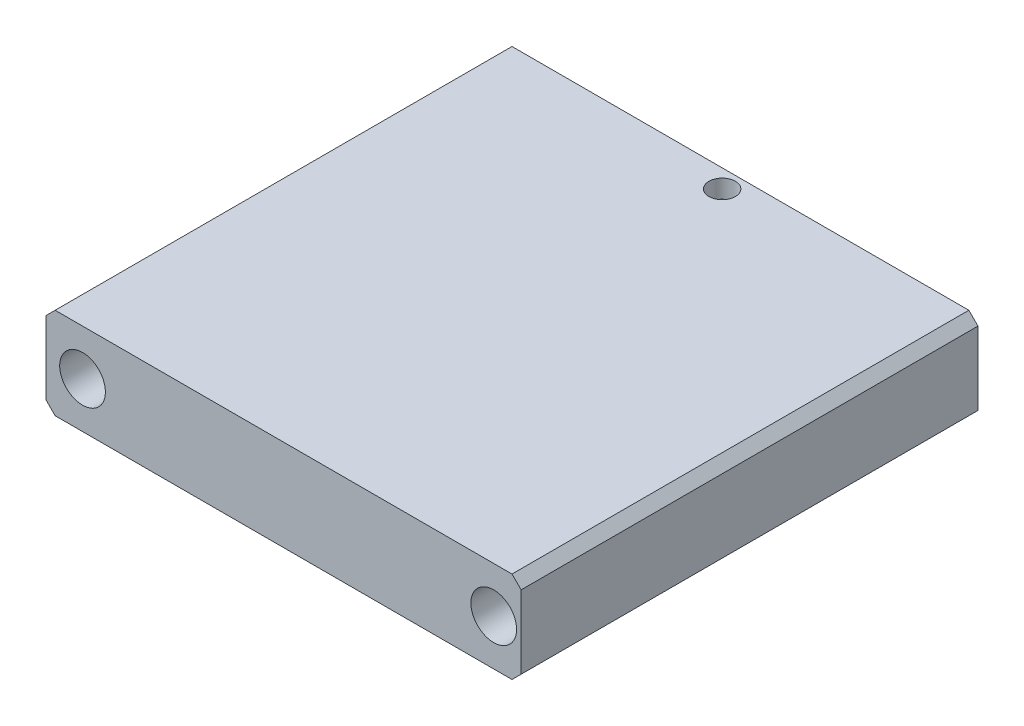
ISO-10303-21;
HEADER;
FILE_DESCRIPTION(('STEP AP214'),'2;1');
FILE_NAME('part.step','',(''),(''),'','','');
FILE_SCHEMA(('AUTOMOTIVE_DESIGN { 1 0 10303 214 1 1 1 1 }'));
ENDSEC;
DATA;
#1=APPLICATION_CONTEXT('core data for automotive mechanical design processes');
#2=APPLICATION_PROTOCOL_DEFINITION('international standard','automotive_design',2000,#1);
#3=PRODUCT_CONTEXT('',#1,'mechanical');
#4=PRODUCT('Part','Part','',(#3));
#5=PRODUCT_RELATED_PRODUCT_CATEGORY('part','',(#4));
#6=PRODUCT_DEFINITION_FORMATION('','',#4);
#7=PRODUCT_DEFINITION_CONTEXT('part definition',#1,'design');
#8=PRODUCT_DEFINITION('design','',#6,#7);
#9=PRODUCT_DEFINITION_SHAPE('','',#8);
#10=(LENGTH_UNIT() NAMED_UNIT(*) SI_UNIT(.MILLI.,.METRE.));
#11=(NAMED_UNIT(*) PLANE_ANGLE_UNIT() SI_UNIT($,.RADIAN.));
#12=(NAMED_UNIT(*) SI_UNIT($,.STERADIAN.) SOLID_ANGLE_UNIT());
#13=UNCERTAINTY_MEASURE_WITH_UNIT(LENGTH_MEASURE(1.E-05),#10,'distance_accuracy_value','');
#14=(GEOMETRIC_REPRESENTATION_CONTEXT(3) GLOBAL_UNCERTAINTY_ASSIGNED_CONTEXT((#13)) GLOBAL_UNIT_ASSIGNED_CONTEXT((#10,
#11,#12)) REPRESENTATION_CONTEXT('',''));
#15=CARTESIAN_POINT('',(0.,0.,0.));
#16=DIRECTION('',(0.,0.,1.));
#17=DIRECTION('',(1.,0.,0.));
#18=AXIS2_PLACEMENT_3D('',#15,#16,#17);
#19=CARTESIAN_POINT('',(0.,0.,0.));
#20=DIRECTION('',(0.,0.,1.));
#21=DIRECTION('',(1.,0.,0.));
#22=AXIS2_PLACEMENT_3D('',#19,#20,#21);
#23=PLANE('',#22);
#24=DIRECTION('',(0.707106781186548,-0.707106781186548,0.));
#25=VECTOR('',#24,1.);
#26=CARTESIAN_POINT('',(-8.12762491607981,-8.50440641170121,0.));
#27=LINE('',#26,#25);
#28=CARTESIAN_POINT('',(-8.12762491607981,-8.50440641170121,0.));
#29=VERTEX_POINT('',#28);
#30=CARTESIAN_POINT('',(-7.12762491607981,-9.50440641170122,0.));
#31=VERTEX_POINT('',#30);
#32=EDGE_CURVE('E155',#29,#31,#27,.T.);
#33=ORIENTED_EDGE('',*,*,#32,.F.);
#34=DIRECTION('',(0.,-1.,0.));
#35=VECTOR('',#34,1.);
#36=CARTESIAN_POINT('',(-8.12762491607981,-0.504406411701206,0.));
#37=LINE('',#36,#35);
#38=CARTESIAN_POINT('',(-8.12762491607981,-0.504406411701206,0.));
#39=VERTEX_POINT('',#38);
#40=EDGE_CURVE('E99',#39,#29,#37,.T.);
#41=ORIENTED_EDGE('',*,*,#40,.F.);
#42=DIRECTION('',(-0.707106781186551,-0.707106781186544,0.));
#43=VECTOR('',#42,1.);
#44=CARTESIAN_POINT('',(-7.12762491607981,0.495593588298785,0.));
#45=LINE('',#44,#43);
#46=CARTESIAN_POINT('',(-7.12762491607981,0.495593588298785,0.));
#47=VERTEX_POINT('',#46);
#48=EDGE_CURVE('E174',#47,#39,#45,.T.);
#49=ORIENTED_EDGE('',*,*,#48,.F.);
#50=DIRECTION('',(-1.,0.,0.));
#51=VECTOR('',#50,1.);
#52=CARTESIAN_POINT('',(42.8723750839202,0.495593588298783,0.));
#53=LINE('',#52,#51);
#54=CARTESIAN_POINT('',(42.8723750839202,0.495593588298783,0.));
#55=VERTEX_POINT('',#54);
#56=EDGE_CURVE('E140',#55,#47,#53,.T.);
#57=ORIENTED_EDGE('',*,*,#56,.F.);
#58=DIRECTION('',(-0.707106781186545,0.70710678118655,0.));
#59=VECTOR('',#58,1.);
#60=CARTESIAN_POINT('',(43.8723750839202,-0.504406411701205,0.));
#61=LINE('',#60,#59);
#62=CARTESIAN_POINT('',(43.8723750839202,-0.504406411701205,0.));
#63=VERTEX_POINT('',#62);
#64=EDGE_CURVE('E169',#63,#55,#61,.T.);
#65=ORIENTED_EDGE('',*,*,#64,.F.);
#66=DIRECTION('',(0.,1.,0.));
#67=VECTOR('',#66,1.);
#68=CARTESIAN_POINT('',(43.8723750839202,-8.50440641170121,0.));
#69=LINE('',#68,#67);
#70=CARTESIAN_POINT('',(43.8723750839202,-8.50440641170121,0.));
#71=VERTEX_POINT('',#70);
#72=EDGE_CURVE('E166',#71,#63,#69,.T.);
#73=ORIENTED_EDGE('',*,*,#72,.F.);
#74=DIRECTION('',(0.707106781186547,0.707106781186548,0.));
#75=VECTOR('',#74,1.);
#76=CARTESIAN_POINT('',(42.8723750839202,-9.50440641170122,0.));
#77=LINE('',#76,#75);
#78=CARTESIAN_POINT('',(42.8723750839202,-9.50440641170122,0.));
#79=VERTEX_POINT('',#78);
#80=EDGE_CURVE('E163',#79,#71,#77,.T.);
#81=ORIENTED_EDGE('',*,*,#80,.F.);
#82=DIRECTION('',(1.,0.,0.));
#83=VECTOR('',#82,1.);
#84=CARTESIAN_POINT('',(-7.12762491607981,-9.50440641170122,0.));
#85=LINE('',#84,#83);
#86=EDGE_CURVE('E159',#31,#79,#85,.T.);
#87=ORIENTED_EDGE('',*,*,#86,.F.);
#88=EDGE_LOOP('',(#33,#41,#49,#57,#65,#73,#81,#87));
#89=FACE_BOUND('',#88,.T.);
#90=CARTESIAN_POINT('',(40.8723750839202,-4.50440641170122,0.));
#91=DIRECTION('',(0.,0.,1.));
#92=DIRECTION('',(1.,0.,0.));
#93=AXIS2_PLACEMENT_3D('',#90,#91,#92);
#94=CIRCLE('',#93,2.5);
#95=CARTESIAN_POINT('',(43.3723750839202,-4.50440641170122,0.));
#96=VERTEX_POINT('',#95);
#97=EDGE_CURVE('E221',#96,#96,#94,.T.);
#98=ORIENTED_EDGE('',*,*,#97,.T.);
#99=EDGE_LOOP('',(#98));
#100=FACE_BOUND('',#99,.T.);
#101=CARTESIAN_POINT('',(-4.12762491607981,-4.50440641170122,0.));
#102=DIRECTION('',(0.,0.,1.));
#103=DIRECTION('',(1.,0.,0.));
#104=AXIS2_PLACEMENT_3D('',#101,#102,#103);
#105=CIRCLE('',#104,2.5);
#106=CARTESIAN_POINT('',(-1.6276249160798,-4.50440641170122,0.));
#107=VERTEX_POINT('',#106);
#108=EDGE_CURVE('E160',#107,#107,#105,.T.);
#109=ORIENTED_EDGE('',*,*,#108,.T.);
#110=EDGE_LOOP('',(#109));
#111=FACE_BOUND('',#110,.T.);
#112=DIRECTION('',(-1.,0.,0.));
#113=VECTOR('',#112,1.);
#114=CARTESIAN_POINT('',(20.8723750839202,-1.50440641170122,0.));
#115=LINE('',#114,#113);
#116=CARTESIAN_POINT('',(20.8723750839202,-1.50440641170122,0.));
#117=VERTEX_POINT('',#116);
#118=CARTESIAN_POINT('',(14.8723750839202,-1.50440641170122,0.));
#119=VERTEX_POINT('',#118);
#120=EDGE_CURVE('E57',#117,#119,#115,.T.);
#121=ORIENTED_EDGE('',*,*,#120,.T.);
#122=DIRECTION('',(0.,-1.,0.));
#123=VECTOR('',#122,1.);
#124=CARTESIAN_POINT('',(14.8723750839202,-1.50440641170122,0.));
#125=LINE('',#124,#123);
#126=CARTESIAN_POINT('',(14.8723750839202,-7.50440641170122,0.));
#127=VERTEX_POINT('',#126);
#128=EDGE_CURVE('E470',#119,#127,#125,.T.);
#129=ORIENTED_EDGE('',*,*,#128,.T.);
#130=DIRECTION('',(-1.,0.,0.));
#131=VECTOR('',#130,1.);
#132=CARTESIAN_POINT('',(20.8723750839202,-7.50440641170122,0.));
#133=LINE('',#132,#131);
#134=CARTESIAN_POINT('',(20.8723750839202,-7.50440641170122,0.));
#135=VERTEX_POINT('',#134);
#136=EDGE_CURVE('E474',#135,#127,#133,.T.);
#137=ORIENTED_EDGE('',*,*,#136,.F.);
#138=DIRECTION('',(0.,-1.,0.));
#139=VECTOR('',#138,1.);
#140=CARTESIAN_POINT('',(20.8723750839202,-1.50440641170122,0.));
#141=LINE('',#140,#139);
#142=EDGE_CURVE('E451',#117,#135,#141,.T.);
#143=ORIENTED_EDGE('',*,*,#142,.F.);
#144=EDGE_LOOP('',(#121,#129,#137,#143));
#145=FACE_BOUND('',#144,.T.);
#146=ADVANCED_FACE('F39',(#89,#100,#111,#145),#23,.F.);
#147=CARTESIAN_POINT('',(17.8723750839202,0.495593588298785,2.));
#148=DIRECTION('',(0.,-1.,0.));
#149=DIRECTION('',(0.,0.,-1.));
#150=AXIS2_PLACEMENT_3D('',#147,#148,#149);
#151=CYLINDRICAL_SURFACE('',#150,1.45);
#152=CARTESIAN_POINT('',(17.8723750839202,0.495593588298785,2.));
#153=DIRECTION('',(0.,-1.,0.));
#154=DIRECTION('',(0.,0.,-1.));
#155=AXIS2_PLACEMENT_3D('',#152,#153,#154);
#156=CIRCLE('',#155,1.45);
#157=CARTESIAN_POINT('',(17.8723750839202,0.495593588298785,0.550000000000002));
#158=VERTEX_POINT('',#157);
#159=EDGE_CURVE('E217',#158,#158,#156,.T.);
#160=ORIENTED_EDGE('',*,*,#159,.F.);
#161=EDGE_LOOP('',(#160));
#162=FACE_BOUND('',#161,.T.);
#163=CARTESIAN_POINT('',(17.8723750839202,-1.50440641170122,2.));
#164=DIRECTION('',(0.,-1.,0.));
#165=DIRECTION('',(0.,0.,-1.));
#166=AXIS2_PLACEMENT_3D('',#163,#164,#165);
#167=CIRCLE('',#166,1.45);
#168=CARTESIAN_POINT('',(17.8723750839202,-1.50440641170122,0.550000000000002));
#169=VERTEX_POINT('',#168);
#170=EDGE_CURVE('E43',#169,#169,#167,.F.);
#171=ORIENTED_EDGE('',*,*,#170,.F.);
#172=EDGE_LOOP('',(#171));
#173=FACE_BOUND('',#172,.T.);
#174=ADVANCED_FACE('F279',(#162,#173),#151,.F.);
#175=CARTESIAN_POINT('',(-8.12762491607981,-8.50440641170121,50.));
#176=DIRECTION('',(0.707106781186548,0.707106781186548,0.));
#177=DIRECTION('',(-0.707106781186548,0.707106781186548,0.));
#178=AXIS2_PLACEMENT_3D('',#175,#176,#177);
#179=PLANE('',#178);
#180=ORIENTED_EDGE('',*,*,#32,.T.);
#181=DIRECTION('',(0.,0.,-1.));
#182=VECTOR('',#181,1.);
#183=CARTESIAN_POINT('',(-7.12762491607981,-9.50440641170122,50.));
#184=LINE('',#183,#182);
#185=CARTESIAN_POINT('',(-7.12762491607981,-9.50440641170122,50.));
#186=VERTEX_POINT('',#185);
#187=EDGE_CURVE('E11',#186,#31,#184,.T.);
#188=ORIENTED_EDGE('',*,*,#187,.F.);
#189=DIRECTION('',(0.707106781186548,-0.707106781186548,0.));
#190=VECTOR('',#189,1.);
#191=CARTESIAN_POINT('',(-8.12762491607981,-8.50440641170121,50.));
#192=LINE('',#191,#190);
#193=CARTESIAN_POINT('',(-8.12762491607981,-8.50440641170121,50.));
#194=VERTEX_POINT('',#193);
#195=EDGE_CURVE('E179',#194,#186,#192,.T.);
#196=ORIENTED_EDGE('',*,*,#195,.F.);
#197=DIRECTION('',(0.,0.,-1.));
#198=VECTOR('',#197,1.);
#199=CARTESIAN_POINT('',(-8.12762491607981,-8.50440641170121,50.));
#200=LINE('',#199,#198);
#201=EDGE_CURVE('E151',#194,#29,#200,.T.);
#202=ORIENTED_EDGE('',*,*,#201,.T.);
#203=EDGE_LOOP('',(#180,#188,#196,#202));
#204=FACE_BOUND('',#203,.T.);
#205=ADVANCED_FACE('F41',(#204),#179,.F.);
#206=CARTESIAN_POINT('',(-7.12762491607981,-9.50440641170122,50.));
#207=DIRECTION('',(0.,1.,0.));
#208=DIRECTION('',(0.,0.,1.));
#209=AXIS2_PLACEMENT_3D('',#206,#207,#208);
#210=PLANE('',#209);
#211=CARTESIAN_POINT('',(17.8723750839202,-9.50440641170122,2.));
#212=DIRECTION('',(0.,-1.,0.));
#213=DIRECTION('',(0.,0.,-1.));
#214=AXIS2_PLACEMENT_3D('',#211,#212,#213);
#215=CIRCLE('',#214,1.45);
#216=CARTESIAN_POINT('',(17.8723750839202,-9.50440641170122,0.550000000000002));
#217=VERTEX_POINT('',#216);
#218=EDGE_CURVE('E205',#217,#217,#215,.T.);
#219=ORIENTED_EDGE('',*,*,#218,.F.);
#220=EDGE_LOOP('',(#219));
#221=FACE_BOUND('',#220,.T.);
#222=ORIENTED_EDGE('',*,*,#86,.T.);
#223=DIRECTION('',(0.,0.,-1.));
#224=VECTOR('',#223,1.);
#225=CARTESIAN_POINT('',(42.8723750839202,-9.50440641170122,50.));
#226=LINE('',#225,#224);
#227=CARTESIAN_POINT('',(42.8723750839202,-9.50440641170122,50.));
#228=VERTEX_POINT('',#227);
#229=EDGE_CURVE('E49',#228,#79,#226,.T.);
#230=ORIENTED_EDGE('',*,*,#229,.F.);
#231=DIRECTION('',(1.,0.,0.));
#232=VECTOR('',#231,1.);
#233=CARTESIAN_POINT('',(-7.12762491607981,-9.50440641170122,50.));
#234=LINE('',#233,#232);
#235=EDGE_CURVE('E107',#186,#228,#234,.T.);
#236=ORIENTED_EDGE('',*,*,#235,.F.);
#237=ORIENTED_EDGE('',*,*,#187,.T.);
#238=EDGE_LOOP('',(#222,#230,#236,#237));
#239=FACE_BOUND('',#238,.T.);
#240=ADVANCED_FACE('F266',(#221,#239),#210,.F.);
#241=CARTESIAN_POINT('',(42.8723750839202,-9.50440641170122,50.));
#242=DIRECTION('',(-0.707106781186548,0.707106781186547,0.));
#243=DIRECTION('',(-0.707106781186547,-0.707106781186548,0.));
#244=AXIS2_PLACEMENT_3D('',#241,#242,#243);
#245=PLANE('',#244);
#246=ORIENTED_EDGE('',*,*,#80,.T.);
#247=DIRECTION('',(0.,0.,-1.));
#248=VECTOR('',#247,1.);
#249=CARTESIAN_POINT('',(43.8723750839202,-8.50440641170121,50.));
#250=LINE('',#249,#248);
#251=CARTESIAN_POINT('',(43.8723750839202,-8.50440641170121,50.));
#252=VERTEX_POINT('',#251);
#253=EDGE_CURVE('E190',#252,#71,#250,.T.);
#254=ORIENTED_EDGE('',*,*,#253,.F.);
#255=DIRECTION('',(0.707106781186547,0.707106781186548,0.));
#256=VECTOR('',#255,1.);
#257=CARTESIAN_POINT('',(42.8723750839202,-9.50440641170122,50.));
#258=LINE('',#257,#256);
#259=EDGE_CURVE('E243',#228,#252,#258,.T.);
#260=ORIENTED_EDGE('',*,*,#259,.F.);
#261=ORIENTED_EDGE('',*,*,#229,.T.);
#262=EDGE_LOOP('',(#246,#254,#260,#261));
#263=FACE_BOUND('',#262,.T.);
#264=ADVANCED_FACE('F269',(#263),#245,.F.);
#265=CARTESIAN_POINT('',(43.8723750839202,-8.50440641170121,50.));
#266=DIRECTION('',(-1.,0.,0.));
#267=DIRECTION('',(0.,0.,1.));
#268=AXIS2_PLACEMENT_3D('',#265,#266,#267);
#269=PLANE('',#268);
#270=ORIENTED_EDGE('',*,*,#72,.T.);
#271=DIRECTION('',(0.,0.,-1.));
#272=VECTOR('',#271,1.);
#273=CARTESIAN_POINT('',(43.8723750839202,-0.504406411701205,50.));
#274=LINE('',#273,#272);
#275=CARTESIAN_POINT('',(43.8723750839202,-0.504406411701205,50.));
#276=VERTEX_POINT('',#275);
#277=EDGE_CURVE('E186',#276,#63,#274,.T.);
#278=ORIENTED_EDGE('',*,*,#277,.F.);
#279=DIRECTION('',(0.,1.,0.));
#280=VECTOR('',#279,1.);
#281=CARTESIAN_POINT('',(43.8723750839202,-8.50440641170121,50.));
#282=LINE('',#281,#280);
#283=EDGE_CURVE('E246',#252,#276,#282,.T.);
#284=ORIENTED_EDGE('',*,*,#283,.F.);
#285=ORIENTED_EDGE('',*,*,#253,.T.);
#286=EDGE_LOOP('',(#270,#278,#284,#285));
#287=FACE_BOUND('',#286,.T.);
#288=ADVANCED_FACE('F254',(#287),#269,.F.);
#289=CARTESIAN_POINT('',(43.8723750839202,-0.504406411701205,50.));
#290=DIRECTION('',(-0.70710678118655,-0.707106781186545,0.));
#291=DIRECTION('',(0.707106781186545,-0.70710678118655,0.));
#292=AXIS2_PLACEMENT_3D('',#289,#290,#291);
#293=PLANE('',#292);
#294=ORIENTED_EDGE('',*,*,#64,.T.);
#295=DIRECTION('',(0.,0.,-1.));
#296=VECTOR('',#295,1.);
#297=CARTESIAN_POINT('',(42.8723750839202,0.495593588298783,50.));
#298=LINE('',#297,#296);
#299=CARTESIAN_POINT('',(42.8723750839202,0.495593588298783,50.));
#300=VERTEX_POINT('',#299);
#301=EDGE_CURVE('E144',#300,#55,#298,.T.);
#302=ORIENTED_EDGE('',*,*,#301,.F.);
#303=DIRECTION('',(-0.707106781186545,0.70710678118655,0.));
#304=VECTOR('',#303,1.);
#305=CARTESIAN_POINT('',(43.8723750839202,-0.504406411701205,50.));
#306=LINE('',#305,#304);
#307=EDGE_CURVE('E130',#276,#300,#306,.T.);
#308=ORIENTED_EDGE('',*,*,#307,.F.);
#309=ORIENTED_EDGE('',*,*,#277,.T.);
#310=EDGE_LOOP('',(#294,#302,#308,#309));
#311=FACE_BOUND('',#310,.T.);
#312=ADVANCED_FACE('F258',(#311),#293,.F.);
#313=CARTESIAN_POINT('',(42.8723750839202,0.495593588298783,50.));
#314=DIRECTION('',(0.,-1.,0.));
#315=DIRECTION('',(1.,0.,0.));
#316=AXIS2_PLACEMENT_3D('',#313,#314,#315);
#317=PLANE('',#316);
#318=ORIENTED_EDGE('',*,*,#159,.T.);
#319=EDGE_LOOP('',(#318));
#320=FACE_BOUND('',#319,.T.);
#321=ORIENTED_EDGE('',*,*,#56,.T.);
#322=DIRECTION('',(0.,0.,-1.));
#323=VECTOR('',#322,1.);
#324=CARTESIAN_POINT('',(-7.12762491607981,0.495593588298785,50.));
#325=LINE('',#324,#323);
#326=CARTESIAN_POINT('',(-7.12762491607981,0.495593588298785,50.));
#327=VERTEX_POINT('',#326);
#328=EDGE_CURVE('E137',#327,#47,#325,.T.);
#329=ORIENTED_EDGE('',*,*,#328,.F.);
#330=DIRECTION('',(-1.,0.,0.));
#331=VECTOR('',#330,1.);
#332=CARTESIAN_POINT('',(42.8723750839202,0.495593588298783,50.));
#333=LINE('',#332,#331);
#334=EDGE_CURVE('E123',#300,#327,#333,.T.);
#335=ORIENTED_EDGE('',*,*,#334,.F.);
#336=ORIENTED_EDGE('',*,*,#301,.T.);
#337=EDGE_LOOP('',(#321,#329,#335,#336));
#338=FACE_BOUND('',#337,.T.);
#339=ADVANCED_FACE('F138',(#320,#338),#317,.F.);
#340=CARTESIAN_POINT('',(-7.12762491607981,0.495593588298785,50.));
#341=DIRECTION('',(0.707106781186544,-0.707106781186551,0.));
#342=DIRECTION('',(0.707106781186551,0.707106781186544,0.));
#343=AXIS2_PLACEMENT_3D('',#340,#341,#342);
#344=PLANE('',#343);
#345=ORIENTED_EDGE('',*,*,#48,.T.);
#346=DIRECTION('',(0.,0.,-1.));
#347=VECTOR('',#346,1.);
#348=CARTESIAN_POINT('',(-8.12762491607981,-0.504406411701206,50.));
#349=LINE('',#348,#347);
#350=CARTESIAN_POINT('',(-8.12762491607981,-0.504406411701206,50.));
#351=VERTEX_POINT('',#350);
#352=EDGE_CURVE('E145',#351,#39,#349,.T.);
#353=ORIENTED_EDGE('',*,*,#352,.F.);
#354=DIRECTION('',(-0.707106781186551,-0.707106781186544,0.));
#355=VECTOR('',#354,1.);
#356=CARTESIAN_POINT('',(-7.12762491607981,0.495593588298785,50.));
#357=LINE('',#356,#355);
#358=EDGE_CURVE('E127',#327,#351,#357,.T.);
#359=ORIENTED_EDGE('',*,*,#358,.F.);
#360=ORIENTED_EDGE('',*,*,#328,.T.);
#361=EDGE_LOOP('',(#345,#353,#359,#360));
#362=FACE_BOUND('',#361,.T.);
#363=ADVANCED_FACE('F147',(#362),#344,.F.);
#364=CARTESIAN_POINT('',(-8.12762491607981,-0.504406411701206,50.));
#365=DIRECTION('',(1.,0.,0.));
#366=DIRECTION('',(0.,1.,0.));
#367=AXIS2_PLACEMENT_3D('',#364,#365,#366);
#368=PLANE('',#367);
#369=ORIENTED_EDGE('',*,*,#40,.T.);
#370=ORIENTED_EDGE('',*,*,#201,.F.);
#371=DIRECTION('',(0.,-1.,0.));
#372=VECTOR('',#371,1.);
#373=CARTESIAN_POINT('',(-8.12762491607981,-0.504406411701206,50.));
#374=LINE('',#373,#372);
#375=EDGE_CURVE('E66',#351,#194,#374,.T.);
#376=ORIENTED_EDGE('',*,*,#375,.F.);
#377=ORIENTED_EDGE('',*,*,#352,.T.);
#378=EDGE_LOOP('',(#369,#370,#376,#377));
#379=FACE_BOUND('',#378,.T.);
#380=ADVANCED_FACE('F262',(#379),#368,.F.);
#381=CARTESIAN_POINT('',(0.,0.,50.));
#382=DIRECTION('',(0.,0.,1.));
#383=DIRECTION('',(1.,0.,0.));
#384=AXIS2_PLACEMENT_3D('',#381,#382,#383);
#385=PLANE('',#384);
#386=CARTESIAN_POINT('',(-4.12762491607981,-4.50440641170122,50.));
#387=DIRECTION('',(0.,0.,1.));
#388=DIRECTION('',(1.,0.,0.));
#389=AXIS2_PLACEMENT_3D('',#386,#387,#388);
#390=CIRCLE('',#389,2.5);
#391=CARTESIAN_POINT('',(-1.6276249160798,-4.50440641170122,50.));
#392=VERTEX_POINT('',#391);
#393=EDGE_CURVE('E228',#392,#392,#390,.T.);
#394=ORIENTED_EDGE('',*,*,#393,.F.);
#395=EDGE_LOOP('',(#394));
#396=FACE_BOUND('',#395,.T.);
#397=CARTESIAN_POINT('',(40.8723750839202,-4.50440641170122,50.));
#398=DIRECTION('',(0.,0.,1.));
#399=DIRECTION('',(1.,0.,0.));
#400=AXIS2_PLACEMENT_3D('',#397,#398,#399);
#401=CIRCLE('',#400,2.5);
#402=CARTESIAN_POINT('',(43.3723750839202,-4.50440641170122,50.));
#403=VERTEX_POINT('',#402);
#404=EDGE_CURVE('E232',#403,#403,#401,.T.);
#405=ORIENTED_EDGE('',*,*,#404,.F.);
#406=EDGE_LOOP('',(#405));
#407=FACE_BOUND('',#406,.T.);
#408=ORIENTED_EDGE('',*,*,#195,.T.);
#409=ORIENTED_EDGE('',*,*,#235,.T.);
#410=ORIENTED_EDGE('',*,*,#259,.T.);
#411=ORIENTED_EDGE('',*,*,#283,.T.);
#412=ORIENTED_EDGE('',*,*,#307,.T.);
#413=ORIENTED_EDGE('',*,*,#334,.T.);
#414=ORIENTED_EDGE('',*,*,#358,.T.);
#415=ORIENTED_EDGE('',*,*,#375,.T.);
#416=EDGE_LOOP('',(#408,#409,#410,#411,#412,#413,#414,#415));
#417=FACE_BOUND('',#416,.T.);
#418=ADVANCED_FACE('F125',(#396,#407,#417),#385,.T.);
#419=CARTESIAN_POINT('',(40.8723750839202,-4.50440641170122,0.));
#420=DIRECTION('',(0.,0.,1.));
#421=DIRECTION('',(1.,0.,0.));
#422=AXIS2_PLACEMENT_3D('',#419,#420,#421);
#423=CYLINDRICAL_SURFACE('',#422,2.5);
#424=ORIENTED_EDGE('',*,*,#97,.F.);
#425=EDGE_LOOP('',(#424));
#426=FACE_BOUND('',#425,.T.);
#427=ORIENTED_EDGE('',*,*,#404,.T.);
#428=EDGE_LOOP('',(#427));
#429=FACE_BOUND('',#428,.T.);
#430=ADVANCED_FACE('F321',(#426,#429),#423,.F.);
#431=CARTESIAN_POINT('',(-4.12762491607981,-4.50440641170122,0.));
#432=DIRECTION('',(0.,0.,1.));
#433=DIRECTION('',(1.,0.,0.));
#434=AXIS2_PLACEMENT_3D('',#431,#432,#433);
#435=CYLINDRICAL_SURFACE('',#434,2.5);
#436=ORIENTED_EDGE('',*,*,#108,.F.);
#437=EDGE_LOOP('',(#436));
#438=FACE_BOUND('',#437,.T.);
#439=ORIENTED_EDGE('',*,*,#393,.T.);
#440=EDGE_LOOP('',(#439));
#441=FACE_BOUND('',#440,.T.);
#442=ADVANCED_FACE('F328',(#438,#441),#435,.F.);
#443=CARTESIAN_POINT('',(17.8723750839202,-7.50440641170122,2.));
#444=DIRECTION('',(0.,-1.,0.));
#445=DIRECTION('',(0.,0.,-1.));
#446=AXIS2_PLACEMENT_3D('',#443,#444,#445);
#447=CIRCLE('',#446,1.45);
#448=CARTESIAN_POINT('',(17.8723750839202,-7.50440641170122,0.550000000000002));
#449=VERTEX_POINT('',#448);
#450=EDGE_CURVE('E196',#449,#449,#447,.F.);
#451=ORIENTED_EDGE('',*,*,#450,.T.);
#452=EDGE_LOOP('',(#451));
#453=FACE_BOUND('',#452,.T.);
#454=ORIENTED_EDGE('',*,*,#218,.T.);
#455=EDGE_LOOP('',(#454));
#456=FACE_BOUND('',#455,.T.);
#457=ADVANCED_FACE('F286',(#453,#456),#151,.F.);
#458=CARTESIAN_POINT('',(20.8723750839202,-1.50440641170122,6.));
#459=DIRECTION('',(0.,-1.,0.));
#460=DIRECTION('',(0.,0.,-1.));
#461=AXIS2_PLACEMENT_3D('',#458,#459,#460);
#462=PLANE('',#461);
#463=ORIENTED_EDGE('',*,*,#120,.F.);
#464=DIRECTION('',(0.,0.,-1.));
#465=VECTOR('',#464,1.);
#466=CARTESIAN_POINT('',(20.8723750839202,-1.50440641170122,6.));
#467=LINE('',#466,#465);
#468=CARTESIAN_POINT('',(20.8723750839202,-1.50440641170122,6.));
#469=VERTEX_POINT('',#468);
#470=EDGE_CURVE('E455',#469,#117,#467,.T.);
#471=ORIENTED_EDGE('',*,*,#470,.F.);
#472=DIRECTION('',(-1.,0.,0.));
#473=VECTOR('',#472,1.);
#474=CARTESIAN_POINT('',(20.8723750839202,-1.50440641170122,6.));
#475=LINE('',#474,#473);
#476=CARTESIAN_POINT('',(14.8723750839202,-1.50440641170122,6.));
#477=VERTEX_POINT('',#476);
#478=EDGE_CURVE('E441',#469,#477,#475,.T.);
#479=ORIENTED_EDGE('',*,*,#478,.T.);
#480=DIRECTION('',(0.,0.,-1.));
#481=VECTOR('',#480,1.);
#482=CARTESIAN_POINT('',(14.8723750839202,-1.50440641170122,6.));
#483=LINE('',#482,#481);
#484=EDGE_CURVE('E199',#477,#119,#483,.T.);
#485=ORIENTED_EDGE('',*,*,#484,.T.);
#486=EDGE_LOOP('',(#463,#471,#479,#485));
#487=FACE_BOUND('',#486,.T.);
#488=ORIENTED_EDGE('',*,*,#170,.T.);
#489=EDGE_LOOP('',(#488));
#490=FACE_BOUND('',#489,.T.);
#491=ADVANCED_FACE('F342',(#487,#490),#462,.T.);
#492=CARTESIAN_POINT('',(20.8723750839202,-7.50440641170122,6.));
#493=DIRECTION('',(0.,-1.,0.));
#494=DIRECTION('',(0.,0.,-1.));
#495=AXIS2_PLACEMENT_3D('',#492,#493,#494);
#496=PLANE('',#495);
#497=ORIENTED_EDGE('',*,*,#136,.T.);
#498=DIRECTION('',(0.,0.,-1.));
#499=VECTOR('',#498,1.);
#500=CARTESIAN_POINT('',(14.8723750839202,-7.50440641170122,6.));
#501=LINE('',#500,#499);
#502=CARTESIAN_POINT('',(14.8723750839202,-7.50440641170122,6.));
#503=VERTEX_POINT('',#502);
#504=EDGE_CURVE('E206',#503,#127,#501,.T.);
#505=ORIENTED_EDGE('',*,*,#504,.F.);
#506=DIRECTION('',(-1.,0.,0.));
#507=VECTOR('',#506,1.);
#508=CARTESIAN_POINT('',(20.8723750839202,-7.50440641170122,6.));
#509=LINE('',#508,#507);
#510=CARTESIAN_POINT('',(20.8723750839202,-7.50440641170122,6.));
#511=VERTEX_POINT('',#510);
#512=EDGE_CURVE('E460',#511,#503,#509,.T.);
#513=ORIENTED_EDGE('',*,*,#512,.F.);
#514=DIRECTION('',(0.,0.,-1.));
#515=VECTOR('',#514,1.);
#516=CARTESIAN_POINT('',(20.8723750839202,-7.50440641170122,6.));
#517=LINE('',#516,#515);
#518=EDGE_CURVE('E213',#511,#135,#517,.T.);
#519=ORIENTED_EDGE('',*,*,#518,.T.);
#520=EDGE_LOOP('',(#497,#505,#513,#519));
#521=FACE_BOUND('',#520,.T.);
#522=ORIENTED_EDGE('',*,*,#450,.F.);
#523=EDGE_LOOP('',(#522));
#524=FACE_BOUND('',#523,.T.);
#525=ADVANCED_FACE('F349',(#521,#524),#496,.F.);
#526=CARTESIAN_POINT('',(14.8723750839202,-1.50440641170122,6.));
#527=DIRECTION('',(1.,0.,0.));
#528=DIRECTION('',(0.,1.,0.));
#529=AXIS2_PLACEMENT_3D('',#526,#527,#528);
#530=PLANE('',#529);
#531=ORIENTED_EDGE('',*,*,#128,.F.);
#532=ORIENTED_EDGE('',*,*,#484,.F.);
#533=DIRECTION('',(0.,-1.,0.));
#534=VECTOR('',#533,1.);
#535=CARTESIAN_POINT('',(14.8723750839202,-1.50440641170122,6.));
#536=LINE('',#535,#534);
#537=EDGE_CURVE('E448',#477,#503,#536,.T.);
#538=ORIENTED_EDGE('',*,*,#537,.T.);
#539=ORIENTED_EDGE('',*,*,#504,.T.);
#540=EDGE_LOOP('',(#531,#532,#538,#539));
#541=FACE_BOUND('',#540,.T.);
#542=ADVANCED_FACE('F356',(#541),#530,.T.);
#543=CARTESIAN_POINT('',(20.8723750839202,-1.50440641170122,6.));
#544=DIRECTION('',(1.,0.,0.));
#545=DIRECTION('',(0.,0.,-1.));
#546=AXIS2_PLACEMENT_3D('',#543,#544,#545);
#547=PLANE('',#546);
#548=ORIENTED_EDGE('',*,*,#142,.T.);
#549=ORIENTED_EDGE('',*,*,#518,.F.);
#550=DIRECTION('',(0.,-1.,0.));
#551=VECTOR('',#550,1.);
#552=CARTESIAN_POINT('',(20.8723750839202,-1.50440641170122,6.));
#553=LINE('',#552,#551);
#554=EDGE_CURVE('E445',#469,#511,#553,.T.);
#555=ORIENTED_EDGE('',*,*,#554,.F.);
#556=ORIENTED_EDGE('',*,*,#470,.T.);
#557=EDGE_LOOP('',(#548,#549,#555,#556));
#558=FACE_BOUND('',#557,.T.);
#559=ADVANCED_FACE('F364',(#558),#547,.F.);
#560=CARTESIAN_POINT('',(0.,0.,6.));
#561=DIRECTION('',(0.,0.,1.));
#562=DIRECTION('',(1.,0.,0.));
#563=AXIS2_PLACEMENT_3D('',#560,#561,#562);
#564=PLANE('',#563);
#565=ORIENTED_EDGE('',*,*,#478,.F.);
#566=ORIENTED_EDGE('',*,*,#554,.T.);
#567=ORIENTED_EDGE('',*,*,#512,.T.);
#568=ORIENTED_EDGE('',*,*,#537,.F.);
#569=EDGE_LOOP('',(#565,#566,#567,#568));
#570=FACE_BOUND('',#569,.T.);
#571=ADVANCED_FACE('F372',(#570),#564,.F.);
#572=CLOSED_SHELL('',(#146,#174,#205,#240,#264,#288,#312,#339,#363,#380,#418,#430,#442,#457,
#491,#525,#542,#559,#571));
#573=MANIFOLD_SOLID_BREP('B2',#572);
#574=ADVANCED_BREP_SHAPE_REPRESENTATION('',(#18,#573),#14);
#575=SHAPE_DEFINITION_REPRESENTATION(#9,#574);
ENDSEC;
END-ISO-10303-21;
